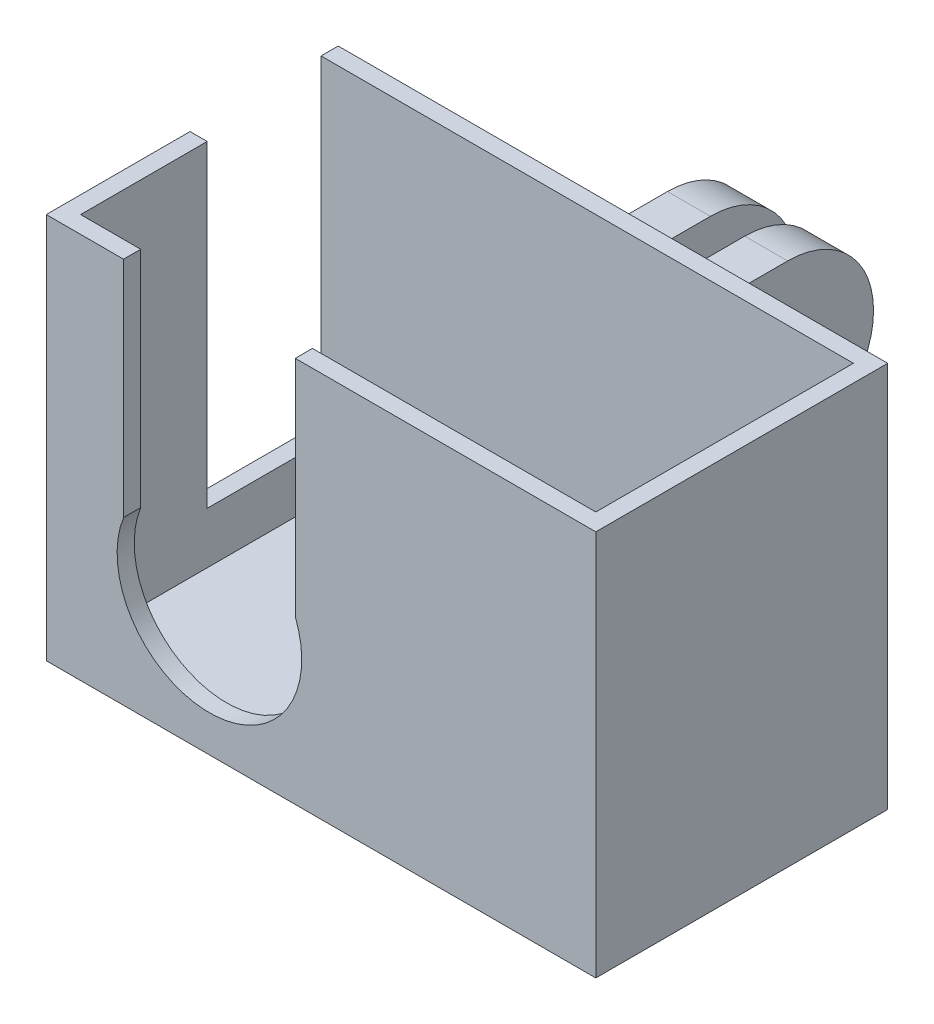
ISO-10303-21;
HEADER;
FILE_DESCRIPTION(('STEP AP214'),'2;1');
FILE_NAME('part.step','',(''),(''),'','','');
FILE_SCHEMA(('AUTOMOTIVE_DESIGN { 1 0 10303 214 1 1 1 1 }'));
ENDSEC;
DATA;
#1=APPLICATION_CONTEXT('core data for automotive mechanical design processes');
#2=APPLICATION_PROTOCOL_DEFINITION('international standard','automotive_design',2000,#1);
#3=PRODUCT_CONTEXT('',#1,'mechanical');
#4=PRODUCT('Part','Part','',(#3));
#5=PRODUCT_RELATED_PRODUCT_CATEGORY('part','',(#4));
#6=PRODUCT_DEFINITION_FORMATION('','',#4);
#7=PRODUCT_DEFINITION_CONTEXT('part definition',#1,'design');
#8=PRODUCT_DEFINITION('design','',#6,#7);
#9=PRODUCT_DEFINITION_SHAPE('','',#8);
#10=(LENGTH_UNIT() NAMED_UNIT(*) SI_UNIT(.MILLI.,.METRE.));
#11=(NAMED_UNIT(*) PLANE_ANGLE_UNIT() SI_UNIT($,.RADIAN.));
#12=(NAMED_UNIT(*) SI_UNIT($,.STERADIAN.) SOLID_ANGLE_UNIT());
#13=UNCERTAINTY_MEASURE_WITH_UNIT(LENGTH_MEASURE(1.E-05),#10,'distance_accuracy_value','');
#14=(GEOMETRIC_REPRESENTATION_CONTEXT(3) GLOBAL_UNCERTAINTY_ASSIGNED_CONTEXT((#13)) GLOBAL_UNIT_ASSIGNED_CONTEXT((#10,
#11,#12)) REPRESENTATION_CONTEXT('',''));
#15=CARTESIAN_POINT('',(0.,0.,0.));
#16=DIRECTION('',(0.,0.,1.));
#17=DIRECTION('',(1.,0.,0.));
#18=AXIS2_PLACEMENT_3D('',#15,#16,#17);
#19=CARTESIAN_POINT('',(-30.346218487395,18.5050420168067,34.));
#20=DIRECTION('',(0.,-1.,0.));
#21=DIRECTION('',(0.,0.,-1.));
#22=AXIS2_PLACEMENT_3D('',#19,#20,#21);
#23=PLANE('',#22);
#24=DIRECTION('',(0.,0.,-1.));
#25=VECTOR('',#24,1.);
#26=CARTESIAN_POINT('',(-30.346218487395,18.5050420168067,34.));
#27=LINE('',#26,#25);
#28=CARTESIAN_POINT('',(-30.346218487395,18.5050420168067,2.));
#29=VERTEX_POINT('',#28);
#30=CARTESIAN_POINT('',(-30.346218487395,18.5050420168067,0.));
#31=VERTEX_POINT('',#30);
#32=EDGE_CURVE('E348',#29,#31,#27,.T.);
#33=ORIENTED_EDGE('',*,*,#32,.F.);
#34=DIRECTION('',(-1.,0.,0.));
#35=VECTOR('',#34,1.);
#36=CARTESIAN_POINT('',(-28.346218487395,18.5050420168067,2.));
#37=LINE('',#36,#35);
#38=CARTESIAN_POINT('',(31.653781512605,18.5050420168067,2.));
#39=VERTEX_POINT('',#38);
#40=EDGE_CURVE('E300',#39,#29,#37,.T.);
#41=ORIENTED_EDGE('',*,*,#40,.F.);
#42=DIRECTION('',(0.,0.,-1.));
#43=VECTOR('',#42,1.);
#44=CARTESIAN_POINT('',(31.653781512605,18.5050420168067,2.));
#45=LINE('',#44,#43);
#46=CARTESIAN_POINT('',(31.653781512605,18.5050420168067,32.));
#47=VERTEX_POINT('',#46);
#48=EDGE_CURVE('E303',#47,#39,#45,.T.);
#49=ORIENTED_EDGE('',*,*,#48,.F.);
#50=DIRECTION('',(1.,0.,0.));
#51=VECTOR('',#50,1.);
#52=CARTESIAN_POINT('',(-28.346218487395,18.5050420168067,32.));
#53=LINE('',#52,#51);
#54=CARTESIAN_POINT('',(-1.34621848739496,18.5050420168067,32.));
#55=VERTEX_POINT('',#54);
#56=EDGE_CURVE('E309',#55,#47,#53,.T.);
#57=ORIENTED_EDGE('',*,*,#56,.F.);
#58=DIRECTION('',(0.,0.,-1.));
#59=VECTOR('',#58,1.);
#60=CARTESIAN_POINT('',(-1.34621848739496,18.5050420168067,32.));
#61=LINE('',#60,#59);
#62=CARTESIAN_POINT('',(-1.34621848739496,18.5050420168067,34.));
#63=VERTEX_POINT('',#62);
#64=EDGE_CURVE('E286',#63,#55,#61,.T.);
#65=ORIENTED_EDGE('',*,*,#64,.F.);
#66=DIRECTION('',(-1.,0.,0.));
#67=VECTOR('',#66,1.);
#68=CARTESIAN_POINT('',(-30.346218487395,18.5050420168067,34.));
#69=LINE('',#68,#67);
#70=CARTESIAN_POINT('',(33.653781512605,18.5050420168067,34.));
#71=VERTEX_POINT('',#70);
#72=EDGE_CURVE('E345',#71,#63,#69,.T.);
#73=ORIENTED_EDGE('',*,*,#72,.F.);
#74=DIRECTION('',(0.,0.,-1.));
#75=VECTOR('',#74,1.);
#76=CARTESIAN_POINT('',(33.653781512605,18.5050420168067,34.));
#77=LINE('',#76,#75);
#78=CARTESIAN_POINT('',(33.653781512605,18.5050420168067,0.));
#79=VERTEX_POINT('',#78);
#80=EDGE_CURVE('E358',#71,#79,#77,.T.);
#81=ORIENTED_EDGE('',*,*,#80,.T.);
#82=DIRECTION('',(-1.,0.,0.));
#83=VECTOR('',#82,1.);
#84=CARTESIAN_POINT('',(-30.346218487395,18.5050420168067,0.));
#85=LINE('',#84,#83);
#86=EDGE_CURVE('E340',#79,#31,#85,.T.);
#87=ORIENTED_EDGE('',*,*,#86,.T.);
#88=EDGE_LOOP('',(#33,#41,#49,#57,#65,#73,#81,#87));
#89=FACE_BOUND('',#88,.T.);
#90=ADVANCED_FACE('F37',(#89),#23,.F.);
#91=CARTESIAN_POINT('',(0.,0.,0.));
#92=DIRECTION('',(0.,0.,1.));
#93=DIRECTION('',(1.,0.,0.));
#94=AXIS2_PLACEMENT_3D('',#91,#92,#93);
#95=PLANE('',#94);
#96=DIRECTION('',(0.,-1.,0.));
#97=VECTOR('',#96,1.);
#98=CARTESIAN_POINT('',(-30.346218487395,18.5050420168067,0.));
#99=LINE('',#98,#97);
#100=CARTESIAN_POINT('',(-30.346218487395,-26.4949579831933,0.));
#101=VERTEX_POINT('',#100);
#102=EDGE_CURVE('E335',#31,#101,#99,.T.);
#103=ORIENTED_EDGE('',*,*,#102,.F.);
#104=ORIENTED_EDGE('',*,*,#86,.F.);
#105=DIRECTION('',(0.,1.,0.));
#106=VECTOR('',#105,1.);
#107=CARTESIAN_POINT('',(33.653781512605,18.5050420168067,0.));
#108=LINE('',#107,#106);
#109=CARTESIAN_POINT('',(33.653781512605,-26.4949579831933,0.));
#110=VERTEX_POINT('',#109);
#111=EDGE_CURVE('E353',#110,#79,#108,.T.);
#112=ORIENTED_EDGE('',*,*,#111,.F.);
#113=DIRECTION('',(1.,0.,0.));
#114=VECTOR('',#113,1.);
#115=CARTESIAN_POINT('',(-30.346218487395,-26.4949579831933,0.));
#116=LINE('',#115,#114);
#117=EDGE_CURVE('E351',#101,#110,#116,.T.);
#118=ORIENTED_EDGE('',*,*,#117,.F.);
#119=EDGE_LOOP('',(#103,#104,#112,#118));
#120=FACE_BOUND('',#119,.T.);
#121=DIRECTION('',(-1.,0.,0.));
#122=VECTOR('',#121,1.);
#123=CARTESIAN_POINT('',(7.,7.99964293282017,0.));
#124=LINE('',#123,#122);
#125=CARTESIAN_POINT('',(7.,7.99964293282017,0.));
#126=VERTEX_POINT('',#125);
#127=CARTESIAN_POINT('',(2.,7.99964293282017,0.));
#128=VERTEX_POINT('',#127);
#129=EDGE_CURVE('E264',#126,#128,#124,.T.);
#130=ORIENTED_EDGE('',*,*,#129,.T.);
#131=DIRECTION('',(0.,-1.,0.));
#132=VECTOR('',#131,1.);
#133=CARTESIAN_POINT('',(2.,7.99964293282017,0.));
#134=LINE('',#133,#132);
#135=CARTESIAN_POINT('',(2.,-12.0003570671798,0.));
#136=VERTEX_POINT('',#135);
#137=EDGE_CURVE('E248',#128,#136,#134,.T.);
#138=ORIENTED_EDGE('',*,*,#137,.T.);
#139=DIRECTION('',(-1.,0.,0.));
#140=VECTOR('',#139,1.);
#141=CARTESIAN_POINT('',(7.,-12.0003570671798,0.));
#142=LINE('',#141,#140);
#143=CARTESIAN_POINT('',(7.,-12.0003570671798,0.));
#144=VERTEX_POINT('',#143);
#145=EDGE_CURVE('E281',#144,#136,#142,.T.);
#146=ORIENTED_EDGE('',*,*,#145,.F.);
#147=DIRECTION('',(0.,-1.,0.));
#148=VECTOR('',#147,1.);
#149=CARTESIAN_POINT('',(7.,7.99964293282017,0.));
#150=LINE('',#149,#148);
#151=EDGE_CURVE('E254',#126,#144,#150,.T.);
#152=ORIENTED_EDGE('',*,*,#151,.F.);
#153=EDGE_LOOP('',(#130,#138,#146,#152));
#154=FACE_BOUND('',#153,.T.);
#155=DIRECTION('',(0.,-1.,0.));
#156=VECTOR('',#155,1.);
#157=CARTESIAN_POINT('',(-7.,-12.0003570671798,0.));
#158=LINE('',#157,#156);
#159=CARTESIAN_POINT('',(-7.,7.99964293282017,0.));
#160=VERTEX_POINT('',#159);
#161=CARTESIAN_POINT('',(-7.,-12.0003570671798,0.));
#162=VERTEX_POINT('',#161);
#163=EDGE_CURVE('E235',#160,#162,#158,.T.);
#164=ORIENTED_EDGE('',*,*,#163,.T.);
#165=DIRECTION('',(1.,0.,0.));
#166=VECTOR('',#165,1.);
#167=CARTESIAN_POINT('',(-7.,-12.0003570671798,0.));
#168=LINE('',#167,#166);
#169=CARTESIAN_POINT('',(-2.,-12.0003570671798,0.));
#170=VERTEX_POINT('',#169);
#171=EDGE_CURVE('E245',#162,#170,#168,.T.);
#172=ORIENTED_EDGE('',*,*,#171,.T.);
#173=DIRECTION('',(0.,-1.,0.));
#174=VECTOR('',#173,1.);
#175=CARTESIAN_POINT('',(-2.,-12.0003570671798,0.));
#176=LINE('',#175,#174);
#177=CARTESIAN_POINT('',(-2.,7.99964293282017,0.));
#178=VERTEX_POINT('',#177);
#179=EDGE_CURVE('E230',#178,#170,#176,.T.);
#180=ORIENTED_EDGE('',*,*,#179,.F.);
#181=DIRECTION('',(1.,0.,0.));
#182=VECTOR('',#181,1.);
#183=CARTESIAN_POINT('',(-7.,7.99964293282017,0.));
#184=LINE('',#183,#182);
#185=EDGE_CURVE('E249',#160,#178,#184,.T.);
#186=ORIENTED_EDGE('',*,*,#185,.F.);
#187=EDGE_LOOP('',(#164,#172,#180,#186));
#188=FACE_BOUND('',#187,.T.);
#189=ADVANCED_FACE('F397',(#120,#154,#188),#95,.F.);
#190=CARTESIAN_POINT('',(-30.346218487395,18.5050420168067,34.));
#191=DIRECTION('',(1.,0.,0.));
#192=DIRECTION('',(0.,1.,0.));
#193=AXIS2_PLACEMENT_3D('',#190,#191,#192);
#194=PLANE('',#193);
#195=DIRECTION('',(0.,0.,1.));
#196=VECTOR('',#195,1.);
#197=CARTESIAN_POINT('',(-30.346218487395,-18.4949579831933,2.));
#198=LINE('',#197,#196);
#199=CARTESIAN_POINT('',(-30.346218487395,-18.4949579831933,2.));
#200=VERTEX_POINT('',#199);
#201=CARTESIAN_POINT('',(-30.346218487395,-18.4949579831933,17.2555006177255));
#202=VERTEX_POINT('',#201);
#203=EDGE_CURVE('E208',#200,#202,#198,.T.);
#204=ORIENTED_EDGE('',*,*,#203,.F.);
#205=DIRECTION('',(0.,-1.,0.));
#206=VECTOR('',#205,1.);
#207=CARTESIAN_POINT('',(-30.346218487395,-18.4949579831933,2.));
#208=LINE('',#207,#206);
#209=EDGE_CURVE('E205',#29,#200,#208,.T.);
#210=ORIENTED_EDGE('',*,*,#209,.F.);
#211=ORIENTED_EDGE('',*,*,#32,.T.);
#212=ORIENTED_EDGE('',*,*,#102,.T.);
#213=DIRECTION('',(0.,0.,-1.));
#214=VECTOR('',#213,1.);
#215=CARTESIAN_POINT('',(-30.346218487395,-26.4949579831933,34.));
#216=LINE('',#215,#214);
#217=CARTESIAN_POINT('',(-30.346218487395,-26.4949579831933,34.));
#218=VERTEX_POINT('',#217);
#219=EDGE_CURVE('E364',#218,#101,#216,.T.);
#220=ORIENTED_EDGE('',*,*,#219,.F.);
#221=DIRECTION('',(0.,-1.,0.));
#222=VECTOR('',#221,1.);
#223=CARTESIAN_POINT('',(-30.346218487395,18.5050420168067,34.));
#224=LINE('',#223,#222);
#225=CARTESIAN_POINT('',(-30.346218487395,18.5050420168067,34.));
#226=VERTEX_POINT('',#225);
#227=EDGE_CURVE('E336',#226,#218,#224,.T.);
#228=ORIENTED_EDGE('',*,*,#227,.F.);
#229=CARTESIAN_POINT('',(-30.346218487395,18.5050420168067,17.2555006177255));
#230=VERTEX_POINT('',#229);
#231=EDGE_CURVE('E216',#226,#230,#27,.T.);
#232=ORIENTED_EDGE('',*,*,#231,.T.);
#233=DIRECTION('',(0.,1.,0.));
#234=VECTOR('',#233,1.);
#235=CARTESIAN_POINT('',(-30.346218487395,-18.4949579831933,17.2555006177255));
#236=LINE('',#235,#234);
#237=EDGE_CURVE('E198',#202,#230,#236,.T.);
#238=ORIENTED_EDGE('',*,*,#237,.F.);
#239=EDGE_LOOP('',(#204,#210,#211,#212,#220,#228,#232,#238));
#240=FACE_BOUND('',#239,.T.);
#241=ADVANCED_FACE('F39',(#240),#194,.F.);
#242=CARTESIAN_POINT('',(-30.346218487395,-26.4949579831933,34.));
#243=DIRECTION('',(0.,1.,0.));
#244=DIRECTION('',(0.,0.,1.));
#245=AXIS2_PLACEMENT_3D('',#242,#243,#244);
#246=PLANE('',#245);
#247=ORIENTED_EDGE('',*,*,#117,.T.);
#248=DIRECTION('',(0.,0.,-1.));
#249=VECTOR('',#248,1.);
#250=CARTESIAN_POINT('',(33.653781512605,-26.4949579831933,34.));
#251=LINE('',#250,#249);
#252=CARTESIAN_POINT('',(33.653781512605,-26.4949579831933,34.));
#253=VERTEX_POINT('',#252);
#254=EDGE_CURVE('E361',#253,#110,#251,.T.);
#255=ORIENTED_EDGE('',*,*,#254,.F.);
#256=DIRECTION('',(1.,0.,0.));
#257=VECTOR('',#256,1.);
#258=CARTESIAN_POINT('',(-30.346218487395,-26.4949579831933,34.));
#259=LINE('',#258,#257);
#260=EDGE_CURVE('E339',#218,#253,#259,.T.);
#261=ORIENTED_EDGE('',*,*,#260,.F.);
#262=ORIENTED_EDGE('',*,*,#219,.T.);
#263=EDGE_LOOP('',(#247,#255,#261,#262));
#264=FACE_BOUND('',#263,.T.);
#265=ADVANCED_FACE('F401',(#264),#246,.F.);
#266=CARTESIAN_POINT('',(33.653781512605,18.5050420168067,34.));
#267=DIRECTION('',(-1.,0.,0.));
#268=DIRECTION('',(0.,0.,1.));
#269=AXIS2_PLACEMENT_3D('',#266,#267,#268);
#270=PLANE('',#269);
#271=ORIENTED_EDGE('',*,*,#111,.T.);
#272=ORIENTED_EDGE('',*,*,#80,.F.);
#273=DIRECTION('',(0.,1.,0.));
#274=VECTOR('',#273,1.);
#275=CARTESIAN_POINT('',(33.653781512605,18.5050420168067,34.));
#276=LINE('',#275,#274);
#277=EDGE_CURVE('E342',#253,#71,#276,.T.);
#278=ORIENTED_EDGE('',*,*,#277,.F.);
#279=ORIENTED_EDGE('',*,*,#254,.T.);
#280=EDGE_LOOP('',(#271,#272,#278,#279));
#281=FACE_BOUND('',#280,.T.);
#282=ADVANCED_FACE('F420',(#281),#270,.F.);
#283=DIRECTION('',(0.,0.,1.));
#284=VECTOR('',#283,1.);
#285=CARTESIAN_POINT('',(-28.346218487395,18.5050420168067,2.));
#286=LINE('',#285,#284);
#287=CARTESIAN_POINT('',(-28.346218487395,18.5050420168067,17.2555006177255));
#288=VERTEX_POINT('',#287);
#289=CARTESIAN_POINT('',(-28.346218487395,18.5050420168067,32.));
#290=VERTEX_POINT('',#289);
#291=EDGE_CURVE('E299',#288,#290,#286,.T.);
#292=ORIENTED_EDGE('',*,*,#291,.F.);
#293=DIRECTION('',(-1.,0.,0.));
#294=VECTOR('',#293,1.);
#295=CARTESIAN_POINT('',(11.6754044069533,18.5050420168067,17.2555006177255));
#296=LINE('',#295,#294);
#297=EDGE_CURVE('E204',#288,#230,#296,.T.);
#298=ORIENTED_EDGE('',*,*,#297,.T.);
#299=ORIENTED_EDGE('',*,*,#231,.F.);
#300=CARTESIAN_POINT('',(-21.346218487395,18.5050420168067,34.));
#301=VERTEX_POINT('',#300);
#302=EDGE_CURVE('E344',#301,#226,#69,.T.);
#303=ORIENTED_EDGE('',*,*,#302,.F.);
#304=DIRECTION('',(0.,0.,1.));
#305=VECTOR('',#304,1.);
#306=CARTESIAN_POINT('',(-21.346218487395,18.5050420168067,32.));
#307=LINE('',#306,#305);
#308=CARTESIAN_POINT('',(-21.346218487395,18.5050420168067,32.));
#309=VERTEX_POINT('',#308);
#310=EDGE_CURVE('E284',#309,#301,#307,.T.);
#311=ORIENTED_EDGE('',*,*,#310,.F.);
#312=EDGE_CURVE('E306',#290,#309,#53,.T.);
#313=ORIENTED_EDGE('',*,*,#312,.F.);
#314=EDGE_LOOP('',(#292,#298,#299,#303,#311,#313));
#315=FACE_BOUND('',#314,.T.);
#316=ADVANCED_FACE('F411',(#315),#23,.F.);
#317=CARTESIAN_POINT('',(0.,0.,34.));
#318=DIRECTION('',(0.,0.,1.));
#319=DIRECTION('',(1.,0.,0.));
#320=AXIS2_PLACEMENT_3D('',#317,#318,#319);
#321=PLANE('',#320);
#322=DIRECTION('',(0.,1.,0.));
#323=VECTOR('',#322,1.);
#324=CARTESIAN_POINT('',(-21.346218487395,-8.49495798319327,34.));
#325=LINE('',#324,#323);
#326=CARTESIAN_POINT('',(-21.346218487395,-7.55002452367841,34.));
#327=VERTEX_POINT('',#326);
#328=EDGE_CURVE('E288',#327,#301,#325,.T.);
#329=ORIENTED_EDGE('',*,*,#328,.T.);
#330=ORIENTED_EDGE('',*,*,#302,.T.);
#331=ORIENTED_EDGE('',*,*,#227,.T.);
#332=ORIENTED_EDGE('',*,*,#260,.T.);
#333=ORIENTED_EDGE('',*,*,#277,.T.);
#334=ORIENTED_EDGE('',*,*,#72,.T.);
#335=DIRECTION('',(0.,1.,0.));
#336=VECTOR('',#335,1.);
#337=CARTESIAN_POINT('',(-1.34621848739496,-8.49495798319327,34.));
#338=LINE('',#337,#336);
#339=CARTESIAN_POINT('',(-1.34621848739496,-7.5500245236784,34.));
#340=VERTEX_POINT('',#339);
#341=EDGE_CURVE('E289',#340,#63,#338,.T.);
#342=ORIENTED_EDGE('',*,*,#341,.F.);
#343=CARTESIAN_POINT('',(-11.346218487395,-11.4949579831933,34.));
#344=DIRECTION('',(0.,0.,1.));
#345=DIRECTION('',(1.,0.,0.));
#346=AXIS2_PLACEMENT_3D('',#343,#344,#345);
#347=CIRCLE('',#346,10.75);
#348=EDGE_CURVE('E332',#327,#340,#347,.T.);
#349=ORIENTED_EDGE('',*,*,#348,.F.);
#350=EDGE_LOOP('',(#329,#330,#331,#332,#333,#334,#342,#349));
#351=FACE_BOUND('',#350,.T.);
#352=ADVANCED_FACE('F405',(#351),#321,.T.);
#353=CARTESIAN_POINT('',(-11.346218487395,-11.4949579831933,28.));
#354=DIRECTION('',(0.,0.,1.));
#355=DIRECTION('',(1.,0.,0.));
#356=AXIS2_PLACEMENT_3D('',#353,#354,#355);
#357=CYLINDRICAL_SURFACE('',#356,10.75);
#358=CARTESIAN_POINT('',(-11.346218487395,-11.4949579831933,32.));
#359=DIRECTION('',(0.,0.,1.));
#360=DIRECTION('',(1.,0.,0.));
#361=AXIS2_PLACEMENT_3D('',#358,#359,#360);
#362=CIRCLE('',#361,10.75);
#363=CARTESIAN_POINT('',(-1.34621848739496,-7.5500245236784,32.));
#364=VERTEX_POINT('',#363);
#365=CARTESIAN_POINT('',(-21.346218487395,-7.55002452367841,32.));
#366=VERTEX_POINT('',#365);
#367=EDGE_CURVE('E330',#364,#366,#362,.F.);
#368=ORIENTED_EDGE('',*,*,#367,.T.);
#369=DIRECTION('',(0.,0.,1.));
#370=VECTOR('',#369,1.);
#371=CARTESIAN_POINT('',(-21.346218487395,-7.55002452367841,28.));
#372=LINE('',#371,#370);
#373=EDGE_CURVE('E296',#366,#327,#372,.T.);
#374=ORIENTED_EDGE('',*,*,#373,.T.);
#375=ORIENTED_EDGE('',*,*,#348,.T.);
#376=DIRECTION('',(0.,0.,1.));
#377=VECTOR('',#376,1.);
#378=CARTESIAN_POINT('',(-1.34621848739496,-7.5500245236784,28.));
#379=LINE('',#378,#377);
#380=EDGE_CURVE('E291',#340,#364,#379,.F.);
#381=ORIENTED_EDGE('',*,*,#380,.T.);
#382=EDGE_LOOP('',(#368,#374,#375,#381));
#383=FACE_BOUND('',#382,.T.);
#384=ADVANCED_FACE('F416',(#383),#357,.F.);
#385=CARTESIAN_POINT('',(0.,0.,32.));
#386=DIRECTION('',(0.,0.,1.));
#387=DIRECTION('',(1.,0.,0.));
#388=AXIS2_PLACEMENT_3D('',#385,#386,#387);
#389=PLANE('',#388);
#390=ORIENTED_EDGE('',*,*,#312,.T.);
#391=DIRECTION('',(0.,-1.,0.));
#392=VECTOR('',#391,1.);
#393=CARTESIAN_POINT('',(-21.346218487395,0.,32.));
#394=LINE('',#393,#392);
#395=EDGE_CURVE('E11',#309,#366,#394,.T.);
#396=ORIENTED_EDGE('',*,*,#395,.T.);
#397=ORIENTED_EDGE('',*,*,#367,.F.);
#398=DIRECTION('',(0.,1.,0.));
#399=VECTOR('',#398,1.);
#400=CARTESIAN_POINT('',(-1.34621848739496,0.,32.));
#401=LINE('',#400,#399);
#402=EDGE_CURVE('E45',#364,#55,#401,.T.);
#403=ORIENTED_EDGE('',*,*,#402,.T.);
#404=ORIENTED_EDGE('',*,*,#56,.T.);
#405=DIRECTION('',(0.,1.,0.));
#406=VECTOR('',#405,1.);
#407=CARTESIAN_POINT('',(31.653781512605,16.5050420168067,32.));
#408=LINE('',#407,#406);
#409=CARTESIAN_POINT('',(31.653781512605,-24.4949579831933,32.));
#410=VERTEX_POINT('',#409);
#411=EDGE_CURVE('E324',#410,#47,#408,.T.);
#412=ORIENTED_EDGE('',*,*,#411,.F.);
#413=DIRECTION('',(1.,0.,0.));
#414=VECTOR('',#413,1.);
#415=CARTESIAN_POINT('',(-28.346218487395,-24.4949579831933,32.));
#416=LINE('',#415,#414);
#417=CARTESIAN_POINT('',(-28.346218487395,-24.4949579831933,32.));
#418=VERTEX_POINT('',#417);
#419=EDGE_CURVE('E321',#418,#410,#416,.T.);
#420=ORIENTED_EDGE('',*,*,#419,.F.);
#421=DIRECTION('',(0.,-1.,0.));
#422=VECTOR('',#421,1.);
#423=CARTESIAN_POINT('',(-28.346218487395,16.5050420168067,32.));
#424=LINE('',#423,#422);
#425=EDGE_CURVE('E317',#290,#418,#424,.T.);
#426=ORIENTED_EDGE('',*,*,#425,.F.);
#427=EDGE_LOOP('',(#390,#396,#397,#403,#404,#412,#420,#426));
#428=FACE_BOUND('',#427,.T.);
#429=ADVANCED_FACE('F372',(#428),#389,.F.);
#430=CARTESIAN_POINT('',(-28.346218487395,16.5050420168067,5.));
#431=DIRECTION('',(-1.,0.,0.));
#432=DIRECTION('',(0.,-1.,0.));
#433=AXIS2_PLACEMENT_3D('',#430,#431,#432);
#434=PLANE('',#433);
#435=DIRECTION('',(0.,1.,0.));
#436=VECTOR('',#435,1.);
#437=CARTESIAN_POINT('',(-28.346218487395,-91.576997308187,2.));
#438=LINE('',#437,#436);
#439=CARTESIAN_POINT('',(-28.346218487395,-24.4949579831933,2.));
#440=VERTEX_POINT('',#439);
#441=CARTESIAN_POINT('',(-28.346218487395,-18.4949579831933,2.));
#442=VERTEX_POINT('',#441);
#443=EDGE_CURVE('E314',#440,#442,#438,.T.);
#444=ORIENTED_EDGE('',*,*,#443,.T.);
#445=DIRECTION('',(0.,0.,-1.));
#446=VECTOR('',#445,1.);
#447=CARTESIAN_POINT('',(-28.346218487395,-18.4949579831933,2.));
#448=LINE('',#447,#446);
#449=CARTESIAN_POINT('',(-28.346218487395,-18.4949579831933,17.2555006177255));
#450=VERTEX_POINT('',#449);
#451=EDGE_CURVE('E222',#450,#442,#448,.T.);
#452=ORIENTED_EDGE('',*,*,#451,.F.);
#453=DIRECTION('',(0.,-1.,0.));
#454=VECTOR('',#453,1.);
#455=CARTESIAN_POINT('',(-28.346218487395,-18.4949579831933,17.2555006177255));
#456=LINE('',#455,#454);
#457=EDGE_CURVE('E201',#288,#450,#456,.T.);
#458=ORIENTED_EDGE('',*,*,#457,.F.);
#459=ORIENTED_EDGE('',*,*,#291,.T.);
#460=ORIENTED_EDGE('',*,*,#425,.T.);
#461=DIRECTION('',(0.,0.,1.));
#462=VECTOR('',#461,1.);
#463=CARTESIAN_POINT('',(-28.346218487395,-24.4949579831933,5.));
#464=LINE('',#463,#462);
#465=EDGE_CURVE('E327',#440,#418,#464,.T.);
#466=ORIENTED_EDGE('',*,*,#465,.F.);
#467=EDGE_LOOP('',(#444,#452,#458,#459,#460,#466));
#468=FACE_BOUND('',#467,.T.);
#469=ADVANCED_FACE('F390',(#468),#434,.F.);
#470=CARTESIAN_POINT('',(31.653781512605,16.5050420168067,5.));
#471=DIRECTION('',(1.,0.,0.));
#472=DIRECTION('',(0.,1.,0.));
#473=AXIS2_PLACEMENT_3D('',#470,#471,#472);
#474=PLANE('',#473);
#475=ORIENTED_EDGE('',*,*,#411,.T.);
#476=ORIENTED_EDGE('',*,*,#48,.T.);
#477=DIRECTION('',(0.,1.,0.));
#478=VECTOR('',#477,1.);
#479=CARTESIAN_POINT('',(31.653781512605,-91.576997308187,2.));
#480=LINE('',#479,#478);
#481=CARTESIAN_POINT('',(31.653781512605,-24.4949579831933,2.));
#482=VERTEX_POINT('',#481);
#483=EDGE_CURVE('E302',#482,#39,#480,.T.);
#484=ORIENTED_EDGE('',*,*,#483,.F.);
#485=DIRECTION('',(0.,0.,1.));
#486=VECTOR('',#485,1.);
#487=CARTESIAN_POINT('',(31.653781512605,-24.4949579831933,5.));
#488=LINE('',#487,#486);
#489=EDGE_CURVE('E328',#482,#410,#488,.T.);
#490=ORIENTED_EDGE('',*,*,#489,.T.);
#491=EDGE_LOOP('',(#475,#476,#484,#490));
#492=FACE_BOUND('',#491,.T.);
#493=ADVANCED_FACE('F383',(#492),#474,.F.);
#494=CARTESIAN_POINT('',(-28.346218487395,-24.4949579831933,5.));
#495=DIRECTION('',(0.,-1.,0.));
#496=DIRECTION('',(0.,0.,-1.));
#497=AXIS2_PLACEMENT_3D('',#494,#495,#496);
#498=PLANE('',#497);
#499=ORIENTED_EDGE('',*,*,#419,.T.);
#500=ORIENTED_EDGE('',*,*,#489,.F.);
#501=DIRECTION('',(-1.,0.,0.));
#502=VECTOR('',#501,1.);
#503=CARTESIAN_POINT('',(-28.346218487395,-24.4949579831933,2.));
#504=LINE('',#503,#502);
#505=EDGE_CURVE('E311',#482,#440,#504,.T.);
#506=ORIENTED_EDGE('',*,*,#505,.T.);
#507=ORIENTED_EDGE('',*,*,#465,.T.);
#508=EDGE_LOOP('',(#499,#500,#506,#507));
#509=FACE_BOUND('',#508,.T.);
#510=ADVANCED_FACE('F387',(#509),#498,.F.);
#511=CARTESIAN_POINT('',(-28.346218487395,-91.576997308187,2.));
#512=DIRECTION('',(0.,0.,-1.));
#513=DIRECTION('',(-1.,0.,0.));
#514=AXIS2_PLACEMENT_3D('',#511,#512,#513);
#515=PLANE('',#514);
#516=ORIENTED_EDGE('',*,*,#483,.T.);
#517=ORIENTED_EDGE('',*,*,#40,.T.);
#518=ORIENTED_EDGE('',*,*,#209,.T.);
#519=DIRECTION('',(-1.,0.,0.));
#520=VECTOR('',#519,1.);
#521=CARTESIAN_POINT('',(11.6754044069533,-18.4949579831933,2.));
#522=LINE('',#521,#520);
#523=EDGE_CURVE('E52',#442,#200,#522,.T.);
#524=ORIENTED_EDGE('',*,*,#523,.F.);
#525=ORIENTED_EDGE('',*,*,#443,.F.);
#526=ORIENTED_EDGE('',*,*,#505,.F.);
#527=EDGE_LOOP('',(#516,#517,#518,#524,#525,#526));
#528=FACE_BOUND('',#527,.T.);
#529=ADVANCED_FACE('F391',(#528),#515,.F.);
#530=CARTESIAN_POINT('',(-1.34621848739496,-8.49495798319327,32.));
#531=DIRECTION('',(1.,0.,0.));
#532=DIRECTION('',(0.,0.,-1.));
#533=AXIS2_PLACEMENT_3D('',#530,#531,#532);
#534=PLANE('',#533);
#535=ORIENTED_EDGE('',*,*,#341,.T.);
#536=ORIENTED_EDGE('',*,*,#64,.T.);
#537=ORIENTED_EDGE('',*,*,#402,.F.);
#538=ORIENTED_EDGE('',*,*,#380,.F.);
#539=EDGE_LOOP('',(#535,#536,#537,#538));
#540=FACE_BOUND('',#539,.T.);
#541=ADVANCED_FACE('F418',(#540),#534,.F.);
#542=CARTESIAN_POINT('',(-21.346218487395,-8.49495798319327,32.));
#543=DIRECTION('',(-1.,0.,0.));
#544=DIRECTION('',(0.,0.,1.));
#545=AXIS2_PLACEMENT_3D('',#542,#543,#544);
#546=PLANE('',#545);
#547=ORIENTED_EDGE('',*,*,#395,.F.);
#548=ORIENTED_EDGE('',*,*,#310,.T.);
#549=ORIENTED_EDGE('',*,*,#328,.F.);
#550=ORIENTED_EDGE('',*,*,#373,.F.);
#551=EDGE_LOOP('',(#547,#548,#549,#550));
#552=FACE_BOUND('',#551,.T.);
#553=ADVANCED_FACE('F414',(#552),#546,.F.);
#554=CARTESIAN_POINT('',(7.,-12.0003570671798,0.));
#555=DIRECTION('',(0.,1.,0.));
#556=DIRECTION('',(0.,0.,1.));
#557=AXIS2_PLACEMENT_3D('',#554,#555,#556);
#558=PLANE('',#557);
#559=DIRECTION('',(0.,0.,-1.));
#560=VECTOR('',#559,1.);
#561=CARTESIAN_POINT('',(2.,-12.0003570671798,0.));
#562=LINE('',#561,#560);
#563=CARTESIAN_POINT('',(2.,-12.0003570671798,-15.));
#564=VERTEX_POINT('',#563);
#565=EDGE_CURVE('E267',#136,#564,#562,.T.);
#566=ORIENTED_EDGE('',*,*,#565,.T.);
#567=DIRECTION('',(-1.,0.,0.));
#568=VECTOR('',#567,1.);
#569=CARTESIAN_POINT('',(7.,-12.0003570671798,-15.));
#570=LINE('',#569,#568);
#571=CARTESIAN_POINT('',(7.,-12.0003570671798,-15.));
#572=VERTEX_POINT('',#571);
#573=EDGE_CURVE('E278',#572,#564,#570,.T.);
#574=ORIENTED_EDGE('',*,*,#573,.F.);
#575=DIRECTION('',(0.,0.,-1.));
#576=VECTOR('',#575,1.);
#577=CARTESIAN_POINT('',(7.,-12.0003570671798,0.));
#578=LINE('',#577,#576);
#579=EDGE_CURVE('E257',#144,#572,#578,.T.);
#580=ORIENTED_EDGE('',*,*,#579,.F.);
#581=ORIENTED_EDGE('',*,*,#145,.T.);
#582=EDGE_LOOP('',(#566,#574,#580,#581));
#583=FACE_BOUND('',#582,.T.);
#584=ADVANCED_FACE('F450',(#583),#558,.F.);
#585=CARTESIAN_POINT('',(7.,-2.00035706717983,-15.));
#586=DIRECTION('',(-1.,0.,0.));
#587=DIRECTION('',(0.,0.,1.));
#588=AXIS2_PLACEMENT_3D('',#585,#586,#587);
#589=CYLINDRICAL_SURFACE('',#588,10.);
#590=CARTESIAN_POINT('',(2.,-2.00035706717983,-15.));
#591=DIRECTION('',(1.,0.,0.));
#592=DIRECTION('',(0.,0.,1.));
#593=AXIS2_PLACEMENT_3D('',#590,#591,#592);
#594=CIRCLE('',#593,10.);
#595=CARTESIAN_POINT('',(2.,7.99964293282017,-15.));
#596=VERTEX_POINT('',#595);
#597=EDGE_CURVE('E269',#564,#596,#594,.T.);
#598=ORIENTED_EDGE('',*,*,#597,.T.);
#599=DIRECTION('',(-1.,0.,0.));
#600=VECTOR('',#599,1.);
#601=CARTESIAN_POINT('',(7.,7.99964293282017,-15.));
#602=LINE('',#601,#600);
#603=CARTESIAN_POINT('',(7.,7.99964293282017,-15.));
#604=VERTEX_POINT('',#603);
#605=EDGE_CURVE('E275',#604,#596,#602,.T.);
#606=ORIENTED_EDGE('',*,*,#605,.F.);
#607=CARTESIAN_POINT('',(7.,-2.00035706717983,-15.));
#608=DIRECTION('',(1.,0.,0.));
#609=DIRECTION('',(0.,0.,1.));
#610=AXIS2_PLACEMENT_3D('',#607,#608,#609);
#611=CIRCLE('',#610,10.);
#612=EDGE_CURVE('E260',#572,#604,#611,.T.);
#613=ORIENTED_EDGE('',*,*,#612,.F.);
#614=ORIENTED_EDGE('',*,*,#573,.T.);
#615=EDGE_LOOP('',(#598,#606,#613,#614));
#616=FACE_BOUND('',#615,.T.);
#617=ADVANCED_FACE('F455',(#616),#589,.T.);
#618=CARTESIAN_POINT('',(7.,7.99964293282017,0.));
#619=DIRECTION('',(0.,-1.,0.));
#620=DIRECTION('',(0.,0.,-1.));
#621=AXIS2_PLACEMENT_3D('',#618,#619,#620);
#622=PLANE('',#621);
#623=DIRECTION('',(0.,0.,1.));
#624=VECTOR('',#623,1.);
#625=CARTESIAN_POINT('',(2.,7.99964293282017,0.));
#626=LINE('',#625,#624);
#627=EDGE_CURVE('E258',#596,#128,#626,.T.);
#628=ORIENTED_EDGE('',*,*,#627,.T.);
#629=ORIENTED_EDGE('',*,*,#129,.F.);
#630=DIRECTION('',(0.,0.,1.));
#631=VECTOR('',#630,1.);
#632=CARTESIAN_POINT('',(7.,7.99964293282017,0.));
#633=LINE('',#632,#631);
#634=EDGE_CURVE('E262',#604,#126,#633,.T.);
#635=ORIENTED_EDGE('',*,*,#634,.F.);
#636=ORIENTED_EDGE('',*,*,#605,.T.);
#637=EDGE_LOOP('',(#628,#629,#635,#636));
#638=FACE_BOUND('',#637,.T.);
#639=ADVANCED_FACE('F459',(#638),#622,.F.);
#640=CARTESIAN_POINT('',(7.,-2.00035706717983,-15.));
#641=DIRECTION('',(-1.,0.,0.));
#642=DIRECTION('',(0.,0.,1.));
#643=AXIS2_PLACEMENT_3D('',#640,#641,#642);
#644=PLANE('',#643);
#645=ORIENTED_EDGE('',*,*,#151,.T.);
#646=ORIENTED_EDGE('',*,*,#579,.T.);
#647=ORIENTED_EDGE('',*,*,#612,.T.);
#648=ORIENTED_EDGE('',*,*,#634,.T.);
#649=EDGE_LOOP('',(#645,#646,#647,#648));
#650=FACE_BOUND('',#649,.T.);
#651=ADVANCED_FACE('F463',(#650),#644,.F.);
#652=CARTESIAN_POINT('',(2.,-2.00035706717983,-15.));
#653=DIRECTION('',(-1.,0.,0.));
#654=DIRECTION('',(0.,0.,1.));
#655=AXIS2_PLACEMENT_3D('',#652,#653,#654);
#656=PLANE('',#655);
#657=ORIENTED_EDGE('',*,*,#137,.F.);
#658=ORIENTED_EDGE('',*,*,#627,.F.);
#659=ORIENTED_EDGE('',*,*,#597,.F.);
#660=ORIENTED_EDGE('',*,*,#565,.F.);
#661=EDGE_LOOP('',(#657,#658,#659,#660));
#662=FACE_BOUND('',#661,.T.);
#663=ADVANCED_FACE('F465',(#662),#656,.T.);
#664=CARTESIAN_POINT('',(-7.,-12.0003570671798,0.));
#665=DIRECTION('',(0.,-1.,0.));
#666=DIRECTION('',(0.,0.,-1.));
#667=AXIS2_PLACEMENT_3D('',#664,#665,#666);
#668=PLANE('',#667);
#669=DIRECTION('',(0.,0.,-1.));
#670=VECTOR('',#669,1.);
#671=CARTESIAN_POINT('',(-2.,-12.0003570671798,0.));
#672=LINE('',#671,#670);
#673=CARTESIAN_POINT('',(-2.,-12.0003570671798,-15.));
#674=VERTEX_POINT('',#673);
#675=EDGE_CURVE('E225',#170,#674,#672,.T.);
#676=ORIENTED_EDGE('',*,*,#675,.F.);
#677=ORIENTED_EDGE('',*,*,#171,.F.);
#678=DIRECTION('',(0.,0.,-1.));
#679=VECTOR('',#678,1.);
#680=CARTESIAN_POINT('',(-7.,-12.0003570671798,0.));
#681=LINE('',#680,#679);
#682=CARTESIAN_POINT('',(-7.,-12.0003570671798,-15.));
#683=VERTEX_POINT('',#682);
#684=EDGE_CURVE('E226',#162,#683,#681,.T.);
#685=ORIENTED_EDGE('',*,*,#684,.T.);
#686=DIRECTION('',(1.,0.,0.));
#687=VECTOR('',#686,1.);
#688=CARTESIAN_POINT('',(-7.,-12.0003570671798,-15.));
#689=LINE('',#688,#687);
#690=EDGE_CURVE('E238',#683,#674,#689,.T.);
#691=ORIENTED_EDGE('',*,*,#690,.T.);
#692=EDGE_LOOP('',(#676,#677,#685,#691));
#693=FACE_BOUND('',#692,.T.);
#694=ADVANCED_FACE('F468',(#693),#668,.T.);
#695=CARTESIAN_POINT('',(-7.,7.99964293282017,0.));
#696=DIRECTION('',(0.,1.,0.));
#697=DIRECTION('',(0.,0.,1.));
#698=AXIS2_PLACEMENT_3D('',#695,#696,#697);
#699=PLANE('',#698);
#700=DIRECTION('',(0.,0.,1.));
#701=VECTOR('',#700,1.);
#702=CARTESIAN_POINT('',(-2.,7.99964293282017,0.));
#703=LINE('',#702,#701);
#704=CARTESIAN_POINT('',(-2.,7.99964293282017,-15.));
#705=VERTEX_POINT('',#704);
#706=EDGE_CURVE('E60',#705,#178,#703,.T.);
#707=ORIENTED_EDGE('',*,*,#706,.F.);
#708=DIRECTION('',(1.,0.,0.));
#709=VECTOR('',#708,1.);
#710=CARTESIAN_POINT('',(-7.,7.99964293282017,-15.));
#711=LINE('',#710,#709);
#712=CARTESIAN_POINT('',(-7.,7.99964293282017,-15.));
#713=VERTEX_POINT('',#712);
#714=EDGE_CURVE('E251',#713,#705,#711,.T.);
#715=ORIENTED_EDGE('',*,*,#714,.F.);
#716=DIRECTION('',(0.,0.,1.));
#717=VECTOR('',#716,1.);
#718=CARTESIAN_POINT('',(-7.,7.99964293282017,0.));
#719=LINE('',#718,#717);
#720=EDGE_CURVE('E233',#713,#160,#719,.T.);
#721=ORIENTED_EDGE('',*,*,#720,.T.);
#722=ORIENTED_EDGE('',*,*,#185,.T.);
#723=EDGE_LOOP('',(#707,#715,#721,#722));
#724=FACE_BOUND('',#723,.T.);
#725=ADVANCED_FACE('F475',(#724),#699,.T.);
#726=CARTESIAN_POINT('',(-7.,-2.00035706717983,-15.));
#727=DIRECTION('',(1.,0.,0.));
#728=DIRECTION('',(0.,0.,-1.));
#729=AXIS2_PLACEMENT_3D('',#726,#727,#728);
#730=CYLINDRICAL_SURFACE('',#729,10.);
#731=CARTESIAN_POINT('',(-2.,-2.00035706717983,-15.));
#732=DIRECTION('',(1.,0.,0.));
#733=DIRECTION('',(0.,0.,-1.));
#734=AXIS2_PLACEMENT_3D('',#731,#732,#733);
#735=CIRCLE('',#734,10.);
#736=EDGE_CURVE('E241',#674,#705,#735,.T.);
#737=ORIENTED_EDGE('',*,*,#736,.F.);
#738=ORIENTED_EDGE('',*,*,#690,.F.);
#739=CARTESIAN_POINT('',(-7.,-2.00035706717983,-15.));
#740=DIRECTION('',(1.,0.,0.));
#741=DIRECTION('',(0.,0.,-1.));
#742=AXIS2_PLACEMENT_3D('',#739,#740,#741);
#743=CIRCLE('',#742,10.);
#744=EDGE_CURVE('E229',#683,#713,#743,.T.);
#745=ORIENTED_EDGE('',*,*,#744,.T.);
#746=ORIENTED_EDGE('',*,*,#714,.T.);
#747=EDGE_LOOP('',(#737,#738,#745,#746));
#748=FACE_BOUND('',#747,.T.);
#749=ADVANCED_FACE('F477',(#748),#730,.T.);
#750=CARTESIAN_POINT('',(-7.,-2.00035706717983,-15.));
#751=DIRECTION('',(1.,0.,0.));
#752=DIRECTION('',(0.,0.,-1.));
#753=AXIS2_PLACEMENT_3D('',#750,#751,#752);
#754=PLANE('',#753);
#755=ORIENTED_EDGE('',*,*,#684,.F.);
#756=ORIENTED_EDGE('',*,*,#163,.F.);
#757=ORIENTED_EDGE('',*,*,#720,.F.);
#758=ORIENTED_EDGE('',*,*,#744,.F.);
#759=EDGE_LOOP('',(#755,#756,#757,#758));
#760=FACE_BOUND('',#759,.T.);
#761=ADVANCED_FACE('F480',(#760),#754,.F.);
#762=CARTESIAN_POINT('',(-2.,-2.00035706717983,-15.));
#763=DIRECTION('',(1.,0.,0.));
#764=DIRECTION('',(0.,0.,-1.));
#765=AXIS2_PLACEMENT_3D('',#762,#763,#764);
#766=PLANE('',#765);
#767=ORIENTED_EDGE('',*,*,#675,.T.);
#768=ORIENTED_EDGE('',*,*,#736,.T.);
#769=ORIENTED_EDGE('',*,*,#706,.T.);
#770=ORIENTED_EDGE('',*,*,#179,.T.);
#771=EDGE_LOOP('',(#767,#768,#769,#770));
#772=FACE_BOUND('',#771,.T.);
#773=ADVANCED_FACE('F485',(#772),#766,.T.);
#774=CARTESIAN_POINT('',(11.6754044069533,-18.4949579831933,2.));
#775=DIRECTION('',(0.,-1.,0.));
#776=DIRECTION('',(0.,0.,-1.));
#777=AXIS2_PLACEMENT_3D('',#774,#775,#776);
#778=PLANE('',#777);
#779=ORIENTED_EDGE('',*,*,#451,.T.);
#780=ORIENTED_EDGE('',*,*,#523,.T.);
#781=ORIENTED_EDGE('',*,*,#203,.T.);
#782=DIRECTION('',(-1.,0.,0.));
#783=VECTOR('',#782,1.);
#784=CARTESIAN_POINT('',(11.6754044069533,-18.4949579831933,17.2555006177255));
#785=LINE('',#784,#783);
#786=EDGE_CURVE('E194',#450,#202,#785,.T.);
#787=ORIENTED_EDGE('',*,*,#786,.F.);
#788=EDGE_LOOP('',(#779,#780,#781,#787));
#789=FACE_BOUND('',#788,.T.);
#790=ADVANCED_FACE('F209',(#789),#778,.F.);
#791=CARTESIAN_POINT('',(11.6754044069533,-18.4949579831933,17.2555006177255));
#792=DIRECTION('',(0.,0.,1.));
#793=DIRECTION('',(1.,0.,0.));
#794=AXIS2_PLACEMENT_3D('',#791,#792,#793);
#795=PLANE('',#794);
#796=ORIENTED_EDGE('',*,*,#457,.T.);
#797=ORIENTED_EDGE('',*,*,#786,.T.);
#798=ORIENTED_EDGE('',*,*,#237,.T.);
#799=ORIENTED_EDGE('',*,*,#297,.F.);
#800=EDGE_LOOP('',(#796,#797,#798,#799));
#801=FACE_BOUND('',#800,.T.);
#802=ADVANCED_FACE('F196',(#801),#795,.F.);
#803=CLOSED_SHELL('',(#90,#189,#241,#265,#282,#316,#352,#384,#429,#469,#493,#510,#529,#541,#553,
#584,#617,#639,#651,#663,#694,#725,#749,#761,#773,#790,#802));
#804=MANIFOLD_SOLID_BREP('B2',#803);
#805=ADVANCED_BREP_SHAPE_REPRESENTATION('',(#18,#804),#14);
#806=SHAPE_DEFINITION_REPRESENTATION(#9,#805);
ENDSEC;
END-ISO-10303-21;
